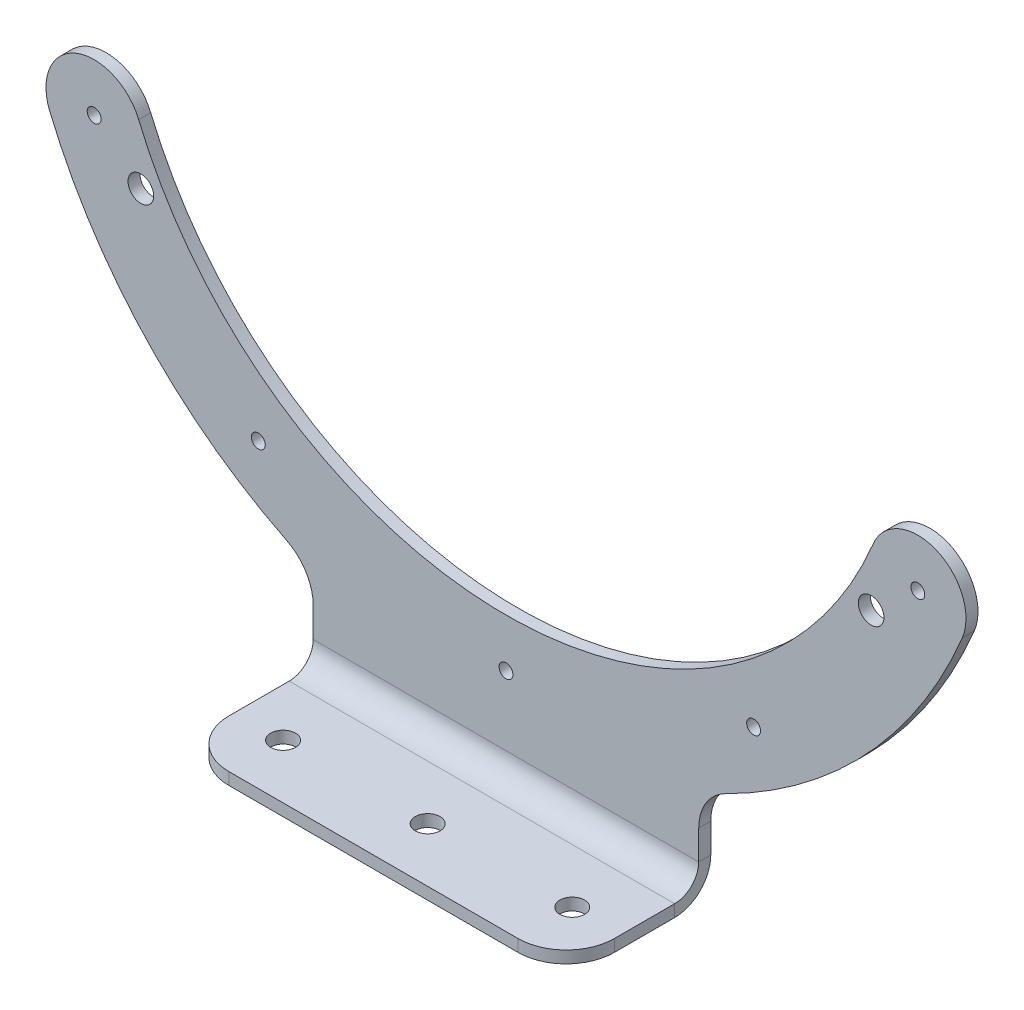
ISO-10303-21;
HEADER;
FILE_DESCRIPTION(('STEP AP214'),'2;1');
FILE_NAME('part.step','',(''),(''),'','','');
FILE_SCHEMA(('AUTOMOTIVE_DESIGN { 1 0 10303 214 1 1 1 1 }'));
ENDSEC;
DATA;
#1=APPLICATION_CONTEXT('core data for automotive mechanical design processes');
#2=APPLICATION_PROTOCOL_DEFINITION('international standard','automotive_design',2000,#1);
#3=PRODUCT_CONTEXT('',#1,'mechanical');
#4=PRODUCT('Part','Part','',(#3));
#5=PRODUCT_RELATED_PRODUCT_CATEGORY('part','',(#4));
#6=PRODUCT_DEFINITION_FORMATION('','',#4);
#7=PRODUCT_DEFINITION_CONTEXT('part definition',#1,'design');
#8=PRODUCT_DEFINITION('design','',#6,#7);
#9=PRODUCT_DEFINITION_SHAPE('','',#8);
#10=(LENGTH_UNIT() NAMED_UNIT(*) SI_UNIT(.MILLI.,.METRE.));
#11=(NAMED_UNIT(*) PLANE_ANGLE_UNIT() SI_UNIT($,.RADIAN.));
#12=(NAMED_UNIT(*) SI_UNIT($,.STERADIAN.) SOLID_ANGLE_UNIT());
#13=UNCERTAINTY_MEASURE_WITH_UNIT(LENGTH_MEASURE(1.E-05),#10,'distance_accuracy_value','');
#14=(GEOMETRIC_REPRESENTATION_CONTEXT(3) GLOBAL_UNCERTAINTY_ASSIGNED_CONTEXT((#13)) GLOBAL_UNIT_ASSIGNED_CONTEXT((#10,
#11,#12)) REPRESENTATION_CONTEXT('',''));
#15=CARTESIAN_POINT('',(0.,0.,0.));
#16=DIRECTION('',(0.,0.,1.));
#17=DIRECTION('',(1.,0.,0.));
#18=AXIS2_PLACEMENT_3D('',#15,#16,#17);
#19=CARTESIAN_POINT('',(50.8,-12.7,-3.175));
#20=DIRECTION('',(1.,0.,0.));
#21=DIRECTION('',(0.,0.,-1.));
#22=AXIS2_PLACEMENT_3D('',#19,#20,#21);
#23=PLANE('',#22);
#24=DIRECTION('',(0.,1.,0.));
#25=VECTOR('',#24,1.);
#26=CARTESIAN_POINT('',(50.8,-12.7,-3.175));
#27=LINE('',#26,#25);
#28=CARTESIAN_POINT('',(50.8,-3.17500000000002,-3.175));
#29=VERTEX_POINT('',#28);
#30=CARTESIAN_POINT('',(50.8,4.56527990568364,-3.175));
#31=VERTEX_POINT('',#30);
#32=EDGE_CURVE('E256',#29,#31,#27,.T.);
#33=ORIENTED_EDGE('',*,*,#32,.T.);
#34=DIRECTION('',(0.,0.,-1.));
#35=VECTOR('',#34,1.);
#36=CARTESIAN_POINT('',(50.8,4.56527990568364,0.));
#37=LINE('',#36,#35);
#38=CARTESIAN_POINT('',(50.8,4.56527990568364,0.));
#39=VERTEX_POINT('',#38);
#40=EDGE_CURVE('E301',#31,#39,#37,.F.);
#41=ORIENTED_EDGE('',*,*,#40,.T.);
#42=DIRECTION('',(0.,1.,0.));
#43=VECTOR('',#42,1.);
#44=CARTESIAN_POINT('',(50.8,-12.7,0.));
#45=LINE('',#44,#43);
#46=CARTESIAN_POINT('',(50.8,-3.17500000000001,0.));
#47=VERTEX_POINT('',#46);
#48=EDGE_CURVE('E242',#47,#39,#45,.T.);
#49=ORIENTED_EDGE('',*,*,#48,.F.);
#50=DIRECTION('',(0.,0.,-1.));
#51=VECTOR('',#50,1.);
#52=CARTESIAN_POINT('',(50.8,-3.17500000000002,0.));
#53=LINE('',#52,#51);
#54=EDGE_CURVE('E225',#47,#29,#53,.T.);
#55=ORIENTED_EDGE('',*,*,#54,.T.);
#56=EDGE_LOOP('',(#33,#41,#49,#55));
#57=FACE_BOUND('',#56,.T.);
#58=ADVANCED_FACE('F56',(#57),#23,.T.);
#59=CARTESIAN_POINT('',(0.,132.553621659923,-3.175));
#60=DIRECTION('',(0.,0.,1.));
#61=DIRECTION('',(1.,0.,0.));
#62=AXIS2_PLACEMENT_3D('',#59,#60,#61);
#63=PLANE('',#62);
#64=CARTESIAN_POINT('',(-96.2370729955459,76.9911216599233,-3.175));
#65=DIRECTION('',(0.,0.,1.));
#66=DIRECTION('',(1.,0.,0.));
#67=AXIS2_PLACEMENT_3D('',#64,#65,#66);
#68=CIRCLE('',#67,3.3782);
#69=CARTESIAN_POINT('',(-92.8588729955459,76.9911216599233,-3.175));
#70=VERTEX_POINT('',#69);
#71=EDGE_CURVE('E775',#70,#70,#68,.T.);
#72=ORIENTED_EDGE('',*,*,#71,.T.);
#73=EDGE_LOOP('',(#72));
#74=FACE_BOUND('',#73,.T.);
#75=CARTESIAN_POINT('',(96.2370729955459,76.9911216599234,-3.175));
#76=DIRECTION('',(0.,0.,1.));
#77=DIRECTION('',(1.,0.,0.));
#78=AXIS2_PLACEMENT_3D('',#75,#76,#77);
#79=CIRCLE('',#78,3.3782);
#80=CARTESIAN_POINT('',(99.6152729955459,76.9911216599234,-3.175));
#81=VERTEX_POINT('',#80);
#82=EDGE_CURVE('E771',#81,#81,#79,.T.);
#83=ORIENTED_EDGE('',*,*,#82,.T.);
#84=EDGE_LOOP('',(#83));
#85=FACE_BOUND('',#84,.T.);
#86=CARTESIAN_POINT('',(108.532748081764,87.5978854428344,-3.175));
#87=DIRECTION('',(0.,0.,1.));
#88=DIRECTION('',(1.,0.,0.));
#89=AXIS2_PLACEMENT_3D('',#86,#87,#88);
#90=CIRCLE('',#89,1.82879999999999);
#91=CARTESIAN_POINT('',(110.361548081763,87.5978854428344,-3.175));
#92=VERTEX_POINT('',#91);
#93=EDGE_CURVE('E767',#92,#92,#90,.T.);
#94=ORIENTED_EDGE('',*,*,#93,.T.);
#95=EDGE_LOOP('',(#94));
#96=FACE_BOUND('',#95,.T.);
#97=CARTESIAN_POINT('',(65.2656131239778,34.8767289546816,-3.175));
#98=DIRECTION('',(0.,0.,1.));
#99=DIRECTION('',(1.,0.,0.));
#100=AXIS2_PLACEMENT_3D('',#97,#98,#99);
#101=CIRCLE('',#100,1.82879999999999);
#102=CARTESIAN_POINT('',(67.0944131239778,34.8767289546816,-3.175));
#103=VERTEX_POINT('',#102);
#104=EDGE_CURVE('E763',#103,#103,#101,.T.);
#105=ORIENTED_EDGE('',*,*,#104,.T.);
#106=EDGE_LOOP('',(#105));
#107=FACE_BOUND('',#106,.T.);
#108=CARTESIAN_POINT('',(0.,15.0786216599231,-3.175));
#109=DIRECTION('',(0.,0.,1.));
#110=DIRECTION('',(1.,0.,0.));
#111=AXIS2_PLACEMENT_3D('',#108,#109,#110);
#112=CIRCLE('',#111,1.82879999999999);
#113=CARTESIAN_POINT('',(1.82879999999992,15.0786216599231,-3.175));
#114=VERTEX_POINT('',#113);
#115=EDGE_CURVE('E758',#114,#114,#112,.T.);
#116=ORIENTED_EDGE('',*,*,#115,.T.);
#117=EDGE_LOOP('',(#116));
#118=FACE_BOUND('',#117,.T.);
#119=CARTESIAN_POINT('',(-65.265613123978,34.8767289546817,-3.175));
#120=DIRECTION('',(0.,0.,1.));
#121=DIRECTION('',(1.,0.,0.));
#122=AXIS2_PLACEMENT_3D('',#119,#120,#121);
#123=CIRCLE('',#122,1.82879999999999);
#124=CARTESIAN_POINT('',(-63.436813123978,34.8767289546817,-3.175));
#125=VERTEX_POINT('',#124);
#126=EDGE_CURVE('E436',#125,#125,#123,.T.);
#127=ORIENTED_EDGE('',*,*,#126,.T.);
#128=EDGE_LOOP('',(#127));
#129=FACE_BOUND('',#128,.T.);
#130=CARTESIAN_POINT('',(-108.532748081764,87.5978854428345,-3.175));
#131=DIRECTION('',(0.,0.,1.));
#132=DIRECTION('',(1.,0.,0.));
#133=AXIS2_PLACEMENT_3D('',#130,#131,#132);
#134=CIRCLE('',#133,1.82879999999999);
#135=CARTESIAN_POINT('',(-106.703948081764,87.5978854428345,-3.175));
#136=VERTEX_POINT('',#135);
#137=EDGE_CURVE('E435',#136,#136,#134,.T.);
#138=ORIENTED_EDGE('',*,*,#137,.T.);
#139=EDGE_LOOP('',(#138));
#140=FACE_BOUND('',#139,.T.);
#141=DIRECTION('',(1.,0.,0.));
#142=VECTOR('',#141,1.);
#143=CARTESIAN_POINT('',(50.8,-3.17500000000002,-3.175));
#144=LINE('',#143,#142);
#145=CARTESIAN_POINT('',(-50.8,-3.17500000000001,-3.175));
#146=VERTEX_POINT('',#145);
#147=EDGE_CURVE('E176',#29,#146,#144,.F.);
#148=ORIENTED_EDGE('',*,*,#147,.T.);
#149=DIRECTION('',(0.,-1.,0.));
#150=VECTOR('',#149,1.);
#151=CARTESIAN_POINT('',(-50.8,-12.7,-3.175));
#152=LINE('',#151,#150);
#153=CARTESIAN_POINT('',(-50.8,4.56527990568364,-3.175));
#154=VERTEX_POINT('',#153);
#155=EDGE_CURVE('E254',#154,#146,#152,.T.);
#156=ORIENTED_EDGE('',*,*,#155,.F.);
#157=CARTESIAN_POINT('',(-63.5,4.56527990568364,-3.175));
#158=DIRECTION('',(0.,0.,1.));
#159=DIRECTION('',(1.,0.,0.));
#160=AXIS2_PLACEMENT_3D('',#157,#158,#159);
#161=CIRCLE('',#160,12.7);
#162=CARTESIAN_POINT('',(-57.8555555555556,15.9420213949494,-3.175));
#163=VERTEX_POINT('',#162);
#164=EDGE_CURVE('E13',#154,#163,#161,.T.);
#165=ORIENTED_EDGE('',*,*,#164,.T.);
#166=CARTESIAN_POINT('',(0.,132.553621659923,-3.175));
#167=DIRECTION('',(0.,0.,1.));
#168=DIRECTION('',(1.,0.,0.));
#169=AXIS2_PLACEMENT_3D('',#166,#167,#168);
#170=CIRCLE('',#169,130.175);
#171=CARTESIAN_POINT('',(-120.266018144657,82.7378058517979,-3.175));
#172=VERTEX_POINT('',#171);
#173=EDGE_CURVE('E251',#172,#163,#170,.T.);
#174=ORIENTED_EDGE('',*,*,#173,.F.);
#175=CARTESIAN_POINT('',(-108.532748081764,87.5978854428345,-3.175));
#176=DIRECTION('',(0.,0.,1.));
#177=DIRECTION('',(-1.,0.,0.));
#178=AXIS2_PLACEMENT_3D('',#175,#176,#177);
#179=CIRCLE('',#178,12.7);
#180=CARTESIAN_POINT('',(-96.7994780188702,92.4579650338711,-3.175));
#181=VERTEX_POINT('',#180);
#182=EDGE_CURVE('E248',#181,#172,#179,.T.);
#183=ORIENTED_EDGE('',*,*,#182,.F.);
#184=CARTESIAN_POINT('',(0.,132.553621659923,-3.175));
#185=DIRECTION('',(0.,0.,-1.));
#186=DIRECTION('',(1.,0.,0.));
#187=AXIS2_PLACEMENT_3D('',#184,#185,#186);
#188=CIRCLE('',#187,104.775);
#189=CARTESIAN_POINT('',(96.7994780188702,92.4579650338711,-3.175));
#190=VERTEX_POINT('',#189);
#191=EDGE_CURVE('E245',#190,#181,#188,.T.);
#192=ORIENTED_EDGE('',*,*,#191,.F.);
#193=CARTESIAN_POINT('',(108.532748081764,87.5978854428345,-3.175));
#194=DIRECTION('',(0.,0.,1.));
#195=DIRECTION('',(-1.,0.,0.));
#196=AXIS2_PLACEMENT_3D('',#193,#194,#195);
#197=CIRCLE('',#196,12.7);
#198=CARTESIAN_POINT('',(120.266018144657,82.7378058517979,-3.175));
#199=VERTEX_POINT('',#198);
#200=EDGE_CURVE('E241',#199,#190,#197,.T.);
#201=ORIENTED_EDGE('',*,*,#200,.F.);
#202=CARTESIAN_POINT('',(0.,132.553621659923,-3.175));
#203=DIRECTION('',(0.,0.,1.));
#204=DIRECTION('',(1.,0.,0.));
#205=AXIS2_PLACEMENT_3D('',#202,#203,#204);
#206=CIRCLE('',#205,130.175);
#207=CARTESIAN_POINT('',(57.8555555555556,15.9420213949494,-3.175));
#208=VERTEX_POINT('',#207);
#209=EDGE_CURVE('E239',#208,#199,#206,.T.);
#210=ORIENTED_EDGE('',*,*,#209,.F.);
#211=CARTESIAN_POINT('',(63.5,4.56527990568364,-3.175));
#212=DIRECTION('',(0.,0.,1.));
#213=DIRECTION('',(1.,0.,0.));
#214=AXIS2_PLACEMENT_3D('',#211,#212,#213);
#215=CIRCLE('',#214,12.7);
#216=EDGE_CURVE('E312',#208,#31,#215,.T.);
#217=ORIENTED_EDGE('',*,*,#216,.T.);
#218=ORIENTED_EDGE('',*,*,#32,.F.);
#219=EDGE_LOOP('',(#148,#156,#165,#174,#183,#192,#201,#210,#217,#218));
#220=FACE_BOUND('',#219,.T.);
#221=ADVANCED_FACE('F316',(#74,#85,#96,#107,#118,#129,#140,#220),#63,.F.);
#222=CARTESIAN_POINT('',(0.,132.553621659923,0.));
#223=DIRECTION('',(0.,0.,1.));
#224=DIRECTION('',(1.,0.,0.));
#225=AXIS2_PLACEMENT_3D('',#222,#223,#224);
#226=PLANE('',#225);
#227=CARTESIAN_POINT('',(-96.2370729955459,76.9911216599233,0.));
#228=DIRECTION('',(0.,0.,1.));
#229=DIRECTION('',(1.,0.,0.));
#230=AXIS2_PLACEMENT_3D('',#227,#228,#229);
#231=CIRCLE('',#230,3.3782);
#232=CARTESIAN_POINT('',(-92.8588729955459,76.9911216599233,0.));
#233=VERTEX_POINT('',#232);
#234=EDGE_CURVE('E410',#233,#233,#231,.T.);
#235=ORIENTED_EDGE('',*,*,#234,.F.);
#236=EDGE_LOOP('',(#235));
#237=FACE_BOUND('',#236,.T.);
#238=CARTESIAN_POINT('',(96.2370729955459,76.9911216599234,0.));
#239=DIRECTION('',(0.,0.,1.));
#240=DIRECTION('',(1.,0.,0.));
#241=AXIS2_PLACEMENT_3D('',#238,#239,#240);
#242=CIRCLE('',#241,3.3782);
#243=CARTESIAN_POINT('',(99.6152729955459,76.9911216599234,0.));
#244=VERTEX_POINT('',#243);
#245=EDGE_CURVE('E414',#244,#244,#242,.T.);
#246=ORIENTED_EDGE('',*,*,#245,.F.);
#247=EDGE_LOOP('',(#246));
#248=FACE_BOUND('',#247,.T.);
#249=CARTESIAN_POINT('',(108.532748081764,87.5978854428344,0.));
#250=DIRECTION('',(0.,0.,1.));
#251=DIRECTION('',(1.,0.,0.));
#252=AXIS2_PLACEMENT_3D('',#249,#250,#251);
#253=CIRCLE('',#252,1.82879999999999);
#254=CARTESIAN_POINT('',(110.361548081763,87.5978854428344,0.));
#255=VERTEX_POINT('',#254);
#256=EDGE_CURVE('E418',#255,#255,#253,.T.);
#257=ORIENTED_EDGE('',*,*,#256,.F.);
#258=EDGE_LOOP('',(#257));
#259=FACE_BOUND('',#258,.T.);
#260=CARTESIAN_POINT('',(65.2656131239778,34.8767289546816,0.));
#261=DIRECTION('',(0.,0.,1.));
#262=DIRECTION('',(1.,0.,0.));
#263=AXIS2_PLACEMENT_3D('',#260,#261,#262);
#264=CIRCLE('',#263,1.82879999999999);
#265=CARTESIAN_POINT('',(67.0944131239778,34.8767289546816,0.));
#266=VERTEX_POINT('',#265);
#267=EDGE_CURVE('E422',#266,#266,#264,.T.);
#268=ORIENTED_EDGE('',*,*,#267,.F.);
#269=EDGE_LOOP('',(#268));
#270=FACE_BOUND('',#269,.T.);
#271=CARTESIAN_POINT('',(0.,15.0786216599231,0.));
#272=DIRECTION('',(0.,0.,1.));
#273=DIRECTION('',(1.,0.,0.));
#274=AXIS2_PLACEMENT_3D('',#271,#272,#273);
#275=CIRCLE('',#274,1.82879999999999);
#276=CARTESIAN_POINT('',(1.82879999999992,15.0786216599231,0.));
#277=VERTEX_POINT('',#276);
#278=EDGE_CURVE('E426',#277,#277,#275,.T.);
#279=ORIENTED_EDGE('',*,*,#278,.F.);
#280=EDGE_LOOP('',(#279));
#281=FACE_BOUND('',#280,.T.);
#282=CARTESIAN_POINT('',(-65.265613123978,34.8767289546817,0.));
#283=DIRECTION('',(0.,0.,1.));
#284=DIRECTION('',(1.,0.,0.));
#285=AXIS2_PLACEMENT_3D('',#282,#283,#284);
#286=CIRCLE('',#285,1.82879999999999);
#287=CARTESIAN_POINT('',(-63.436813123978,34.8767289546817,0.));
#288=VERTEX_POINT('',#287);
#289=EDGE_CURVE('E430',#288,#288,#286,.T.);
#290=ORIENTED_EDGE('',*,*,#289,.F.);
#291=EDGE_LOOP('',(#290));
#292=FACE_BOUND('',#291,.T.);
#293=CARTESIAN_POINT('',(-108.532748081764,87.5978854428345,0.));
#294=DIRECTION('',(0.,0.,1.));
#295=DIRECTION('',(1.,0.,0.));
#296=AXIS2_PLACEMENT_3D('',#293,#294,#295);
#297=CIRCLE('',#296,1.82879999999999);
#298=CARTESIAN_POINT('',(-106.703948081764,87.5978854428345,0.));
#299=VERTEX_POINT('',#298);
#300=EDGE_CURVE('E433',#299,#299,#297,.T.);
#301=ORIENTED_EDGE('',*,*,#300,.F.);
#302=EDGE_LOOP('',(#301));
#303=FACE_BOUND('',#302,.T.);
#304=CARTESIAN_POINT('',(0.,132.553621659923,0.));
#305=DIRECTION('',(0.,0.,1.));
#306=DIRECTION('',(1.,0.,0.));
#307=AXIS2_PLACEMENT_3D('',#304,#305,#306);
#308=CIRCLE('',#307,130.175);
#309=CARTESIAN_POINT('',(-120.266018144657,82.7378058517979,0.));
#310=VERTEX_POINT('',#309);
#311=CARTESIAN_POINT('',(-57.8555555555556,15.9420213949494,0.));
#312=VERTEX_POINT('',#311);
#313=EDGE_CURVE('E270',#310,#312,#308,.T.);
#314=ORIENTED_EDGE('',*,*,#313,.T.);
#315=CARTESIAN_POINT('',(-63.5,4.56527990568364,0.));
#316=DIRECTION('',(0.,0.,1.));
#317=DIRECTION('',(1.,0.,0.));
#318=AXIS2_PLACEMENT_3D('',#315,#316,#317);
#319=CIRCLE('',#318,12.7);
#320=CARTESIAN_POINT('',(-50.8,4.56527990568364,0.));
#321=VERTEX_POINT('',#320);
#322=EDGE_CURVE('E64',#312,#321,#319,.F.);
#323=ORIENTED_EDGE('',*,*,#322,.T.);
#324=DIRECTION('',(0.,-1.,0.));
#325=VECTOR('',#324,1.);
#326=CARTESIAN_POINT('',(-50.8,-12.7,0.));
#327=LINE('',#326,#325);
#328=CARTESIAN_POINT('',(-50.8,-3.17500000000003,0.));
#329=VERTEX_POINT('',#328);
#330=EDGE_CURVE('E272',#321,#329,#327,.T.);
#331=ORIENTED_EDGE('',*,*,#330,.T.);
#332=DIRECTION('',(1.,0.,0.));
#333=VECTOR('',#332,1.);
#334=CARTESIAN_POINT('',(50.8,-3.17500000000002,0.));
#335=LINE('',#334,#333);
#336=EDGE_CURVE('E229',#47,#329,#335,.F.);
#337=ORIENTED_EDGE('',*,*,#336,.F.);
#338=ORIENTED_EDGE('',*,*,#48,.T.);
#339=CARTESIAN_POINT('',(63.5,4.56527990568364,0.));
#340=DIRECTION('',(0.,0.,1.));
#341=DIRECTION('',(1.,0.,0.));
#342=AXIS2_PLACEMENT_3D('',#339,#340,#341);
#343=CIRCLE('',#342,12.7);
#344=CARTESIAN_POINT('',(57.8555555555556,15.9420213949494,0.));
#345=VERTEX_POINT('',#344);
#346=EDGE_CURVE('E310',#39,#345,#343,.F.);
#347=ORIENTED_EDGE('',*,*,#346,.T.);
#348=CARTESIAN_POINT('',(0.,132.553621659923,0.));
#349=DIRECTION('',(0.,0.,1.));
#350=DIRECTION('',(1.,0.,0.));
#351=AXIS2_PLACEMENT_3D('',#348,#349,#350);
#352=CIRCLE('',#351,130.175);
#353=CARTESIAN_POINT('',(120.266018144657,82.7378058517979,0.));
#354=VERTEX_POINT('',#353);
#355=EDGE_CURVE('E236',#345,#354,#352,.T.);
#356=ORIENTED_EDGE('',*,*,#355,.T.);
#357=CARTESIAN_POINT('',(108.532748081764,87.5978854428345,0.));
#358=DIRECTION('',(0.,0.,1.));
#359=DIRECTION('',(-1.,0.,0.));
#360=AXIS2_PLACEMENT_3D('',#357,#358,#359);
#361=CIRCLE('',#360,12.7);
#362=CARTESIAN_POINT('',(96.7994780188702,92.4579650338711,0.));
#363=VERTEX_POINT('',#362);
#364=EDGE_CURVE('E261',#354,#363,#361,.T.);
#365=ORIENTED_EDGE('',*,*,#364,.T.);
#366=CARTESIAN_POINT('',(0.,132.553621659923,0.));
#367=DIRECTION('',(0.,0.,-1.));
#368=DIRECTION('',(1.,0.,0.));
#369=AXIS2_PLACEMENT_3D('',#366,#367,#368);
#370=CIRCLE('',#369,104.775);
#371=CARTESIAN_POINT('',(-96.7994780188702,92.4579650338711,0.));
#372=VERTEX_POINT('',#371);
#373=EDGE_CURVE('E264',#363,#372,#370,.T.);
#374=ORIENTED_EDGE('',*,*,#373,.T.);
#375=CARTESIAN_POINT('',(-108.532748081764,87.5978854428345,0.));
#376=DIRECTION('',(0.,0.,1.));
#377=DIRECTION('',(-1.,0.,0.));
#378=AXIS2_PLACEMENT_3D('',#375,#376,#377);
#379=CIRCLE('',#378,12.7);
#380=EDGE_CURVE('E267',#372,#310,#379,.T.);
#381=ORIENTED_EDGE('',*,*,#380,.T.);
#382=EDGE_LOOP('',(#314,#323,#331,#337,#338,#347,#356,#365,#374,#381));
#383=FACE_BOUND('',#382,.T.);
#384=ADVANCED_FACE('F325',(#237,#248,#259,#270,#281,#292,#303,#383),#226,.T.);
#385=CARTESIAN_POINT('',(0.,132.553621659923,-3.175));
#386=DIRECTION('',(0.,0.,1.));
#387=DIRECTION('',(1.,0.,0.));
#388=AXIS2_PLACEMENT_3D('',#385,#386,#387);
#389=CYLINDRICAL_SURFACE('',#388,130.175);
#390=ORIENTED_EDGE('',*,*,#355,.F.);
#391=DIRECTION('',(0.,0.,1.));
#392=VECTOR('',#391,1.);
#393=CARTESIAN_POINT('',(57.8555555555556,15.9420213949494,-3.175));
#394=LINE('',#393,#392);
#395=EDGE_CURVE('E304',#345,#208,#394,.F.);
#396=ORIENTED_EDGE('',*,*,#395,.T.);
#397=ORIENTED_EDGE('',*,*,#209,.T.);
#398=DIRECTION('',(0.,0.,1.));
#399=VECTOR('',#398,1.);
#400=CARTESIAN_POINT('',(120.266018144657,82.7378058517979,-3.175));
#401=LINE('',#400,#399);
#402=EDGE_CURVE('E259',#199,#354,#401,.T.);
#403=ORIENTED_EDGE('',*,*,#402,.T.);
#404=EDGE_LOOP('',(#390,#396,#397,#403));
#405=FACE_BOUND('',#404,.T.);
#406=ADVANCED_FACE('F327',(#405),#389,.T.);
#407=CARTESIAN_POINT('',(-50.8,-12.7,-3.175));
#408=DIRECTION('',(-1.,0.,0.));
#409=DIRECTION('',(0.,0.,1.));
#410=AXIS2_PLACEMENT_3D('',#407,#408,#409);
#411=PLANE('',#410);
#412=ORIENTED_EDGE('',*,*,#330,.F.);
#413=DIRECTION('',(0.,0.,-1.));
#414=VECTOR('',#413,1.);
#415=CARTESIAN_POINT('',(-50.8,4.56527990568364,-3.175));
#416=LINE('',#415,#414);
#417=EDGE_CURVE('E71',#321,#154,#416,.T.);
#418=ORIENTED_EDGE('',*,*,#417,.T.);
#419=ORIENTED_EDGE('',*,*,#155,.T.);
#420=DIRECTION('',(0.,0.,-1.));
#421=VECTOR('',#420,1.);
#422=CARTESIAN_POINT('',(-50.8,-3.17500000000003,0.));
#423=LINE('',#422,#421);
#424=EDGE_CURVE('E233',#329,#146,#423,.T.);
#425=ORIENTED_EDGE('',*,*,#424,.F.);
#426=EDGE_LOOP('',(#412,#418,#419,#425));
#427=FACE_BOUND('',#426,.T.);
#428=ADVANCED_FACE('F348',(#427),#411,.T.);
#429=CARTESIAN_POINT('',(0.,132.553621659923,-3.175));
#430=DIRECTION('',(0.,0.,1.));
#431=DIRECTION('',(1.,0.,0.));
#432=AXIS2_PLACEMENT_3D('',#429,#430,#431);
#433=CYLINDRICAL_SURFACE('',#432,130.175);
#434=ORIENTED_EDGE('',*,*,#173,.T.);
#435=DIRECTION('',(0.,0.,1.));
#436=VECTOR('',#435,1.);
#437=CARTESIAN_POINT('',(-57.8555555555556,15.9420213949494,-3.175));
#438=LINE('',#437,#436);
#439=EDGE_CURVE('E306',#163,#312,#438,.T.);
#440=ORIENTED_EDGE('',*,*,#439,.T.);
#441=ORIENTED_EDGE('',*,*,#313,.F.);
#442=DIRECTION('',(0.,0.,1.));
#443=VECTOR('',#442,1.);
#444=CARTESIAN_POINT('',(-120.266018144657,82.7378058517979,-3.175));
#445=LINE('',#444,#443);
#446=EDGE_CURVE('E276',#172,#310,#445,.T.);
#447=ORIENTED_EDGE('',*,*,#446,.F.);
#448=EDGE_LOOP('',(#434,#440,#441,#447));
#449=FACE_BOUND('',#448,.T.);
#450=ADVANCED_FACE('F343',(#449),#433,.T.);
#451=CARTESIAN_POINT('',(-108.532748081764,87.5978854428345,-3.175));
#452=DIRECTION('',(0.,0.,1.));
#453=DIRECTION('',(1.,0.,0.));
#454=AXIS2_PLACEMENT_3D('',#451,#452,#453);
#455=CYLINDRICAL_SURFACE('',#454,12.7);
#456=ORIENTED_EDGE('',*,*,#380,.F.);
#457=DIRECTION('',(0.,0.,1.));
#458=VECTOR('',#457,1.);
#459=CARTESIAN_POINT('',(-96.7994780188702,92.4579650338711,-3.175));
#460=LINE('',#459,#458);
#461=EDGE_CURVE('E279',#181,#372,#460,.T.);
#462=ORIENTED_EDGE('',*,*,#461,.F.);
#463=ORIENTED_EDGE('',*,*,#182,.T.);
#464=ORIENTED_EDGE('',*,*,#446,.T.);
#465=EDGE_LOOP('',(#456,#462,#463,#464));
#466=FACE_BOUND('',#465,.T.);
#467=ADVANCED_FACE('F339',(#466),#455,.T.);
#468=CARTESIAN_POINT('',(0.,132.553621659923,-3.175));
#469=DIRECTION('',(0.,0.,1.));
#470=DIRECTION('',(1.,0.,0.));
#471=AXIS2_PLACEMENT_3D('',#468,#469,#470);
#472=CYLINDRICAL_SURFACE('',#471,104.775);
#473=ORIENTED_EDGE('',*,*,#373,.F.);
#474=DIRECTION('',(0.,0.,1.));
#475=VECTOR('',#474,1.);
#476=CARTESIAN_POINT('',(96.7994780188702,92.4579650338711,-3.175));
#477=LINE('',#476,#475);
#478=EDGE_CURVE('E281',#190,#363,#477,.T.);
#479=ORIENTED_EDGE('',*,*,#478,.F.);
#480=ORIENTED_EDGE('',*,*,#191,.T.);
#481=ORIENTED_EDGE('',*,*,#461,.T.);
#482=EDGE_LOOP('',(#473,#479,#480,#481));
#483=FACE_BOUND('',#482,.T.);
#484=ADVANCED_FACE('F335',(#483),#472,.F.);
#485=CARTESIAN_POINT('',(108.532748081764,87.5978854428345,-3.175));
#486=DIRECTION('',(0.,0.,1.));
#487=DIRECTION('',(1.,0.,0.));
#488=AXIS2_PLACEMENT_3D('',#485,#486,#487);
#489=CYLINDRICAL_SURFACE('',#488,12.7);
#490=ORIENTED_EDGE('',*,*,#364,.F.);
#491=ORIENTED_EDGE('',*,*,#402,.F.);
#492=ORIENTED_EDGE('',*,*,#200,.T.);
#493=ORIENTED_EDGE('',*,*,#478,.T.);
#494=EDGE_LOOP('',(#490,#491,#492,#493));
#495=FACE_BOUND('',#494,.T.);
#496=ADVANCED_FACE('F331',(#495),#489,.T.);
#497=CARTESIAN_POINT('',(-50.8,-3.17500000000003,6.35));
#498=DIRECTION('',(-1.,0.,0.));
#499=DIRECTION('',(0.,0.,1.));
#500=AXIS2_PLACEMENT_3D('',#497,#498,#499);
#501=PLANE('',#500);
#502=DIRECTION('',(0.,1.,0.));
#503=VECTOR('',#502,1.);
#504=CARTESIAN_POINT('',(-50.8,-12.7,6.34999999999997));
#505=LINE('',#504,#503);
#506=CARTESIAN_POINT('',(-50.8,-9.52500000000002,6.34999999999998));
#507=VERTEX_POINT('',#506);
#508=CARTESIAN_POINT('',(-50.8,-12.7,6.34999999999997));
#509=VERTEX_POINT('',#508);
#510=EDGE_CURVE('E219',#507,#509,#505,.F.);
#511=ORIENTED_EDGE('',*,*,#510,.F.);
#512=CARTESIAN_POINT('',(-50.8,-3.17500000000003,6.35));
#513=DIRECTION('',(1.,0.,0.));
#514=DIRECTION('',(0.,0.,-1.));
#515=AXIS2_PLACEMENT_3D('',#512,#513,#514);
#516=CIRCLE('',#515,6.35);
#517=EDGE_CURVE('E179',#329,#507,#516,.F.);
#518=ORIENTED_EDGE('',*,*,#517,.F.);
#519=ORIENTED_EDGE('',*,*,#424,.T.);
#520=CARTESIAN_POINT('',(-50.8,-3.17500000000003,6.35));
#521=DIRECTION('',(1.,0.,0.));
#522=DIRECTION('',(0.,0.,-1.));
#523=AXIS2_PLACEMENT_3D('',#520,#521,#522);
#524=CIRCLE('',#523,9.525);
#525=EDGE_CURVE('E224',#146,#509,#524,.F.);
#526=ORIENTED_EDGE('',*,*,#525,.T.);
#527=EDGE_LOOP('',(#511,#518,#519,#526));
#528=FACE_BOUND('',#527,.T.);
#529=ADVANCED_FACE('F355',(#528),#501,.T.);
#530=CARTESIAN_POINT('',(50.8,-3.17500000000002,6.34999999999999));
#531=DIRECTION('',(-1.,0.,0.));
#532=DIRECTION('',(0.,0.,1.));
#533=AXIS2_PLACEMENT_3D('',#530,#531,#532);
#534=PLANE('',#533);
#535=CARTESIAN_POINT('',(50.8,-3.17500000000002,6.34999999999999));
#536=DIRECTION('',(1.,0.,0.));
#537=DIRECTION('',(0.,0.,-1.));
#538=AXIS2_PLACEMENT_3D('',#535,#536,#537);
#539=CIRCLE('',#538,6.35);
#540=CARTESIAN_POINT('',(50.8,-9.52500000000001,6.34999999999997));
#541=VERTEX_POINT('',#540);
#542=EDGE_CURVE('E186',#541,#47,#539,.T.);
#543=ORIENTED_EDGE('',*,*,#542,.F.);
#544=DIRECTION('',(0.,1.,0.));
#545=VECTOR('',#544,1.);
#546=CARTESIAN_POINT('',(50.8,-9.52500000000002,6.34999999999997));
#547=LINE('',#546,#545);
#548=CARTESIAN_POINT('',(50.8,-12.7,6.34999999999996));
#549=VERTEX_POINT('',#548);
#550=EDGE_CURVE('E183',#541,#549,#547,.F.);
#551=ORIENTED_EDGE('',*,*,#550,.T.);
#552=CARTESIAN_POINT('',(50.8,-3.17500000000002,6.34999999999999));
#553=DIRECTION('',(1.,0.,0.));
#554=DIRECTION('',(0.,0.,-1.));
#555=AXIS2_PLACEMENT_3D('',#552,#553,#554);
#556=CIRCLE('',#555,9.525);
#557=EDGE_CURVE('E168',#549,#29,#556,.T.);
#558=ORIENTED_EDGE('',*,*,#557,.T.);
#559=ORIENTED_EDGE('',*,*,#54,.F.);
#560=EDGE_LOOP('',(#543,#551,#558,#559));
#561=FACE_BOUND('',#560,.T.);
#562=ADVANCED_FACE('F184',(#561),#534,.F.);
#563=CARTESIAN_POINT('',(50.8,-3.17500000000002,6.34999999999999));
#564=DIRECTION('',(1.,0.,0.));
#565=DIRECTION('',(0.,-1.,0.));
#566=AXIS2_PLACEMENT_3D('',#563,#564,#565);
#567=CYLINDRICAL_SURFACE('',#566,9.525);
#568=ORIENTED_EDGE('',*,*,#147,.F.);
#569=ORIENTED_EDGE('',*,*,#557,.F.);
#570=DIRECTION('',(1.,0.,0.));
#571=VECTOR('',#570,1.);
#572=CARTESIAN_POINT('',(-50.8,-12.7,6.34999999999997));
#573=LINE('',#572,#571);
#574=EDGE_CURVE('E173',#549,#509,#573,.F.);
#575=ORIENTED_EDGE('',*,*,#574,.T.);
#576=ORIENTED_EDGE('',*,*,#525,.F.);
#577=EDGE_LOOP('',(#568,#569,#575,#576));
#578=FACE_BOUND('',#577,.T.);
#579=ADVANCED_FACE('F170',(#578),#567,.T.);
#580=CARTESIAN_POINT('',(50.8,-3.17500000000002,6.34999999999999));
#581=DIRECTION('',(1.,0.,0.));
#582=DIRECTION('',(0.,-1.,0.));
#583=AXIS2_PLACEMENT_3D('',#580,#581,#582);
#584=CYLINDRICAL_SURFACE('',#583,6.35);
#585=ORIENTED_EDGE('',*,*,#336,.T.);
#586=ORIENTED_EDGE('',*,*,#517,.T.);
#587=DIRECTION('',(1.,0.,0.));
#588=VECTOR('',#587,1.);
#589=CARTESIAN_POINT('',(-50.8,-9.52500000000002,6.34999999999998));
#590=LINE('',#589,#588);
#591=EDGE_CURVE('E191',#507,#541,#590,.T.);
#592=ORIENTED_EDGE('',*,*,#591,.T.);
#593=ORIENTED_EDGE('',*,*,#542,.T.);
#594=EDGE_LOOP('',(#585,#586,#592,#593));
#595=FACE_BOUND('',#594,.T.);
#596=ADVANCED_FACE('F352',(#595),#584,.F.);
#597=CARTESIAN_POINT('',(-50.8,-12.7,0.));
#598=DIRECTION('',(1.,0.,0.));
#599=DIRECTION('',(0.,0.,-1.));
#600=AXIS2_PLACEMENT_3D('',#597,#598,#599);
#601=PLANE('',#600);
#602=DIRECTION('',(0.,0.,-1.));
#603=VECTOR('',#602,1.);
#604=CARTESIAN_POINT('',(-50.8,-12.7,0.));
#605=LINE('',#604,#603);
#606=CARTESIAN_POINT('',(-50.8,-12.7000000000001,22.225));
#607=VERTEX_POINT('',#606);
#608=EDGE_CURVE('E199',#607,#509,#605,.T.);
#609=ORIENTED_EDGE('',*,*,#608,.F.);
#610=DIRECTION('',(0.,1.,0.));
#611=VECTOR('',#610,1.);
#612=CARTESIAN_POINT('',(-50.8,-12.7000000000001,22.225));
#613=LINE('',#612,#611);
#614=CARTESIAN_POINT('',(-50.8,-9.52500000000008,22.225));
#615=VERTEX_POINT('',#614);
#616=EDGE_CURVE('E298',#607,#615,#613,.T.);
#617=ORIENTED_EDGE('',*,*,#616,.T.);
#618=DIRECTION('',(0.,0.,1.));
#619=VECTOR('',#618,1.);
#620=CARTESIAN_POINT('',(-50.8,-9.525,0.));
#621=LINE('',#620,#619);
#622=EDGE_CURVE('E200',#615,#507,#621,.F.);
#623=ORIENTED_EDGE('',*,*,#622,.T.);
#624=ORIENTED_EDGE('',*,*,#510,.T.);
#625=EDGE_LOOP('',(#609,#617,#623,#624));
#626=FACE_BOUND('',#625,.T.);
#627=ADVANCED_FACE('F357',(#626),#601,.F.);
#628=CARTESIAN_POINT('',(50.8,-12.7000000000001,34.925));
#629=DIRECTION('',(-1.,0.,0.));
#630=DIRECTION('',(0.,0.,1.));
#631=AXIS2_PLACEMENT_3D('',#628,#629,#630);
#632=PLANE('',#631);
#633=DIRECTION('',(0.,0.,-1.));
#634=VECTOR('',#633,1.);
#635=CARTESIAN_POINT('',(50.8,-9.52500000000012,34.925));
#636=LINE('',#635,#634);
#637=CARTESIAN_POINT('',(50.8,-9.52500000000008,22.225));
#638=VERTEX_POINT('',#637);
#639=EDGE_CURVE('E215',#541,#638,#636,.F.);
#640=ORIENTED_EDGE('',*,*,#639,.T.);
#641=DIRECTION('',(0.,1.,0.));
#642=VECTOR('',#641,1.);
#643=CARTESIAN_POINT('',(50.8,-12.7000000000001,22.225));
#644=LINE('',#643,#642);
#645=CARTESIAN_POINT('',(50.8,-12.7000000000001,22.225));
#646=VERTEX_POINT('',#645);
#647=EDGE_CURVE('E204',#638,#646,#644,.F.);
#648=ORIENTED_EDGE('',*,*,#647,.T.);
#649=DIRECTION('',(0.,0.,1.));
#650=VECTOR('',#649,1.);
#651=CARTESIAN_POINT('',(50.8,-12.7,0.));
#652=LINE('',#651,#650);
#653=EDGE_CURVE('E196',#549,#646,#652,.T.);
#654=ORIENTED_EDGE('',*,*,#653,.F.);
#655=ORIENTED_EDGE('',*,*,#550,.F.);
#656=EDGE_LOOP('',(#640,#648,#654,#655));
#657=FACE_BOUND('',#656,.T.);
#658=ADVANCED_FACE('F202',(#657),#632,.F.);
#659=CARTESIAN_POINT('',(0.,-12.7,0.));
#660=DIRECTION('',(0.,1.,0.));
#661=DIRECTION('',(0.,0.,1.));
#662=AXIS2_PLACEMENT_3D('',#659,#660,#661);
#663=PLANE('',#662);
#664=CARTESIAN_POINT('',(38.1,-12.7000000000001,20.6375));
#665=DIRECTION('',(0.,1.,0.));
#666=DIRECTION('',(0.,0.,1.));
#667=AXIS2_PLACEMENT_3D('',#664,#665,#666);
#668=CIRCLE('',#667,3.26389999999999);
#669=CARTESIAN_POINT('',(38.1,-12.7000000000001,23.9014));
#670=VERTEX_POINT('',#669);
#671=EDGE_CURVE('E447',#670,#670,#668,.T.);
#672=ORIENTED_EDGE('',*,*,#671,.T.);
#673=EDGE_LOOP('',(#672));
#674=FACE_BOUND('',#673,.T.);
#675=CARTESIAN_POINT('',(0.,-12.7000000000001,20.6375));
#676=DIRECTION('',(0.,1.,0.));
#677=DIRECTION('',(0.,0.,1.));
#678=AXIS2_PLACEMENT_3D('',#675,#676,#677);
#679=CIRCLE('',#678,3.26389999999999);
#680=CARTESIAN_POINT('',(0.,-12.7000000000001,23.9014));
#681=VERTEX_POINT('',#680);
#682=EDGE_CURVE('E453',#681,#681,#679,.T.);
#683=ORIENTED_EDGE('',*,*,#682,.T.);
#684=EDGE_LOOP('',(#683));
#685=FACE_BOUND('',#684,.T.);
#686=CARTESIAN_POINT('',(-38.1,-12.7000000000001,20.6375));
#687=DIRECTION('',(0.,1.,0.));
#688=DIRECTION('',(0.,0.,1.));
#689=AXIS2_PLACEMENT_3D('',#686,#687,#688);
#690=CIRCLE('',#689,3.26389999999999);
#691=CARTESIAN_POINT('',(-38.1,-12.7000000000001,23.9014));
#692=VERTEX_POINT('',#691);
#693=EDGE_CURVE('E222',#692,#692,#690,.T.);
#694=ORIENTED_EDGE('',*,*,#693,.T.);
#695=EDGE_LOOP('',(#694));
#696=FACE_BOUND('',#695,.T.);
#697=ORIENTED_EDGE('',*,*,#653,.T.);
#698=CARTESIAN_POINT('',(38.1,-12.7000000000001,22.225));
#699=DIRECTION('',(0.,1.,0.));
#700=DIRECTION('',(0.,0.,1.));
#701=AXIS2_PLACEMENT_3D('',#698,#699,#700);
#702=CIRCLE('',#701,12.7);
#703=CARTESIAN_POINT('',(38.1,-12.7000000000001,34.925));
#704=VERTEX_POINT('',#703);
#705=EDGE_CURVE('E296',#646,#704,#702,.F.);
#706=ORIENTED_EDGE('',*,*,#705,.T.);
#707=DIRECTION('',(-1.,0.,0.));
#708=VECTOR('',#707,1.);
#709=CARTESIAN_POINT('',(0.,-12.7000000000001,34.925));
#710=LINE('',#709,#708);
#711=CARTESIAN_POINT('',(-38.1,-12.7000000000001,34.925));
#712=VERTEX_POINT('',#711);
#713=EDGE_CURVE('E205',#704,#712,#710,.T.);
#714=ORIENTED_EDGE('',*,*,#713,.T.);
#715=CARTESIAN_POINT('',(-38.1,-12.7000000000001,22.225));
#716=DIRECTION('',(0.,1.,0.));
#717=DIRECTION('',(0.,0.,1.));
#718=AXIS2_PLACEMENT_3D('',#715,#716,#717);
#719=CIRCLE('',#718,12.7);
#720=EDGE_CURVE('E294',#712,#607,#719,.F.);
#721=ORIENTED_EDGE('',*,*,#720,.T.);
#722=ORIENTED_EDGE('',*,*,#608,.T.);
#723=ORIENTED_EDGE('',*,*,#574,.F.);
#724=EDGE_LOOP('',(#697,#706,#714,#721,#722,#723));
#725=FACE_BOUND('',#724,.T.);
#726=ADVANCED_FACE('F195',(#674,#685,#696,#725),#663,.F.);
#727=CARTESIAN_POINT('',(0.,-9.525,0.));
#728=DIRECTION('',(0.,1.,0.));
#729=DIRECTION('',(0.,0.,1.));
#730=AXIS2_PLACEMENT_3D('',#727,#728,#729);
#731=PLANE('',#730);
#732=CARTESIAN_POINT('',(38.1,-9.52500000000007,20.6375));
#733=DIRECTION('',(0.,1.,0.));
#734=DIRECTION('',(0.,0.,1.));
#735=AXIS2_PLACEMENT_3D('',#732,#733,#734);
#736=CIRCLE('',#735,3.26389999999999);
#737=CARTESIAN_POINT('',(38.1,-9.52500000000008,23.9014));
#738=VERTEX_POINT('',#737);
#739=EDGE_CURVE('E439',#738,#738,#736,.T.);
#740=ORIENTED_EDGE('',*,*,#739,.F.);
#741=EDGE_LOOP('',(#740));
#742=FACE_BOUND('',#741,.T.);
#743=CARTESIAN_POINT('',(0.,-9.52500000000007,20.6375));
#744=DIRECTION('',(0.,1.,0.));
#745=DIRECTION('',(0.,0.,1.));
#746=AXIS2_PLACEMENT_3D('',#743,#744,#745);
#747=CIRCLE('',#746,3.2639);
#748=CARTESIAN_POINT('',(0.,-9.52500000000008,23.9014));
#749=VERTEX_POINT('',#748);
#750=EDGE_CURVE('E450',#749,#749,#747,.T.);
#751=ORIENTED_EDGE('',*,*,#750,.F.);
#752=EDGE_LOOP('',(#751));
#753=FACE_BOUND('',#752,.T.);
#754=CARTESIAN_POINT('',(-38.1,-9.52500000000007,20.6375));
#755=DIRECTION('',(0.,1.,0.));
#756=DIRECTION('',(0.,0.,1.));
#757=AXIS2_PLACEMENT_3D('',#754,#755,#756);
#758=CIRCLE('',#757,3.26389999999999);
#759=CARTESIAN_POINT('',(-38.1,-9.52500000000008,23.9014));
#760=VERTEX_POINT('',#759);
#761=EDGE_CURVE('E456',#760,#760,#758,.T.);
#762=ORIENTED_EDGE('',*,*,#761,.F.);
#763=EDGE_LOOP('',(#762));
#764=FACE_BOUND('',#763,.T.);
#765=DIRECTION('',(1.,0.,0.));
#766=VECTOR('',#765,1.);
#767=CARTESIAN_POINT('',(-50.8,-9.52500000000012,34.925));
#768=LINE('',#767,#766);
#769=CARTESIAN_POINT('',(38.1,-9.52500000000012,34.925));
#770=VERTEX_POINT('',#769);
#771=CARTESIAN_POINT('',(-38.1,-9.52500000000012,34.925));
#772=VERTEX_POINT('',#771);
#773=EDGE_CURVE('E209',#770,#772,#768,.F.);
#774=ORIENTED_EDGE('',*,*,#773,.F.);
#775=CARTESIAN_POINT('',(38.1,-9.52500000000007,22.225));
#776=DIRECTION('',(0.,1.,0.));
#777=DIRECTION('',(0.,0.,1.));
#778=AXIS2_PLACEMENT_3D('',#775,#776,#777);
#779=CIRCLE('',#778,12.7);
#780=EDGE_CURVE('E291',#770,#638,#779,.T.);
#781=ORIENTED_EDGE('',*,*,#780,.T.);
#782=ORIENTED_EDGE('',*,*,#639,.F.);
#783=ORIENTED_EDGE('',*,*,#591,.F.);
#784=ORIENTED_EDGE('',*,*,#622,.F.);
#785=CARTESIAN_POINT('',(-38.1,-9.52500000000007,22.225));
#786=DIRECTION('',(0.,1.,0.));
#787=DIRECTION('',(0.,0.,1.));
#788=AXIS2_PLACEMENT_3D('',#785,#786,#787);
#789=CIRCLE('',#788,12.7);
#790=EDGE_CURVE('E289',#615,#772,#789,.T.);
#791=ORIENTED_EDGE('',*,*,#790,.T.);
#792=EDGE_LOOP('',(#774,#781,#782,#783,#784,#791));
#793=FACE_BOUND('',#792,.T.);
#794=ADVANCED_FACE('F362',(#742,#753,#764,#793),#731,.T.);
#795=CARTESIAN_POINT('',(-50.8,-12.7000000000001,34.925));
#796=DIRECTION('',(0.,0.,-1.));
#797=DIRECTION('',(0.,1.,0.));
#798=AXIS2_PLACEMENT_3D('',#795,#796,#797);
#799=PLANE('',#798);
#800=ORIENTED_EDGE('',*,*,#713,.F.);
#801=DIRECTION('',(0.,1.,0.));
#802=VECTOR('',#801,1.);
#803=CARTESIAN_POINT('',(38.1,-12.7000000000001,34.925));
#804=LINE('',#803,#802);
#805=EDGE_CURVE('E286',#704,#770,#804,.T.);
#806=ORIENTED_EDGE('',*,*,#805,.T.);
#807=ORIENTED_EDGE('',*,*,#773,.T.);
#808=DIRECTION('',(0.,1.,0.));
#809=VECTOR('',#808,1.);
#810=CARTESIAN_POINT('',(-38.1,-12.7000000000001,34.925));
#811=LINE('',#810,#809);
#812=EDGE_CURVE('E278',#772,#712,#811,.F.);
#813=ORIENTED_EDGE('',*,*,#812,.T.);
#814=EDGE_LOOP('',(#800,#806,#807,#813));
#815=FACE_BOUND('',#814,.T.);
#816=ADVANCED_FACE('F369',(#815),#799,.F.);
#817=CARTESIAN_POINT('',(-38.1,-9.52500000000007,20.6375));
#818=DIRECTION('',(0.,1.,0.));
#819=DIRECTION('',(0.,0.,1.));
#820=AXIS2_PLACEMENT_3D('',#817,#818,#819);
#821=CYLINDRICAL_SURFACE('',#820,3.26389999999999);
#822=ORIENTED_EDGE('',*,*,#761,.T.);
#823=EDGE_LOOP('',(#822));
#824=FACE_BOUND('',#823,.T.);
#825=ORIENTED_EDGE('',*,*,#693,.F.);
#826=EDGE_LOOP('',(#825));
#827=FACE_BOUND('',#826,.T.);
#828=ADVANCED_FACE('F462',(#824,#827),#821,.F.);
#829=CARTESIAN_POINT('',(0.,-9.52500000000007,20.6375));
#830=DIRECTION('',(0.,1.,0.));
#831=DIRECTION('',(0.,0.,1.));
#832=AXIS2_PLACEMENT_3D('',#829,#830,#831);
#833=CYLINDRICAL_SURFACE('',#832,3.26389999999999);
#834=ORIENTED_EDGE('',*,*,#750,.T.);
#835=EDGE_LOOP('',(#834));
#836=FACE_BOUND('',#835,.T.);
#837=ORIENTED_EDGE('',*,*,#682,.F.);
#838=EDGE_LOOP('',(#837));
#839=FACE_BOUND('',#838,.T.);
#840=ADVANCED_FACE('F464',(#836,#839),#833,.F.);
#841=CARTESIAN_POINT('',(38.1,-9.52500000000007,20.6375));
#842=DIRECTION('',(0.,1.,0.));
#843=DIRECTION('',(0.,0.,1.));
#844=AXIS2_PLACEMENT_3D('',#841,#842,#843);
#845=CYLINDRICAL_SURFACE('',#844,3.26389999999999);
#846=ORIENTED_EDGE('',*,*,#739,.T.);
#847=EDGE_LOOP('',(#846));
#848=FACE_BOUND('',#847,.T.);
#849=ORIENTED_EDGE('',*,*,#671,.F.);
#850=EDGE_LOOP('',(#849));
#851=FACE_BOUND('',#850,.T.);
#852=ADVANCED_FACE('F471',(#848,#851),#845,.F.);
#853=CARTESIAN_POINT('',(-108.532748081764,87.5978854428345,0.));
#854=DIRECTION('',(0.,0.,1.));
#855=DIRECTION('',(1.,0.,0.));
#856=AXIS2_PLACEMENT_3D('',#853,#854,#855);
#857=CYLINDRICAL_SURFACE('',#856,1.82879999999999);
#858=ORIENTED_EDGE('',*,*,#300,.T.);
#859=EDGE_LOOP('',(#858));
#860=FACE_BOUND('',#859,.T.);
#861=ORIENTED_EDGE('',*,*,#137,.F.);
#862=EDGE_LOOP('',(#861));
#863=FACE_BOUND('',#862,.T.);
#864=ADVANCED_FACE('F605',(#860,#863),#857,.F.);
#865=CARTESIAN_POINT('',(-65.265613123978,34.8767289546817,0.));
#866=DIRECTION('',(0.,0.,1.));
#867=DIRECTION('',(1.,0.,0.));
#868=AXIS2_PLACEMENT_3D('',#865,#866,#867);
#869=CYLINDRICAL_SURFACE('',#868,1.82879999999999);
#870=ORIENTED_EDGE('',*,*,#289,.T.);
#871=EDGE_LOOP('',(#870));
#872=FACE_BOUND('',#871,.T.);
#873=ORIENTED_EDGE('',*,*,#126,.F.);
#874=EDGE_LOOP('',(#873));
#875=FACE_BOUND('',#874,.T.);
#876=ADVANCED_FACE('F601',(#872,#875),#869,.F.);
#877=CARTESIAN_POINT('',(0.,15.0786216599231,0.));
#878=DIRECTION('',(0.,0.,1.));
#879=DIRECTION('',(1.,0.,0.));
#880=AXIS2_PLACEMENT_3D('',#877,#878,#879);
#881=CYLINDRICAL_SURFACE('',#880,1.82879999999999);
#882=ORIENTED_EDGE('',*,*,#278,.T.);
#883=EDGE_LOOP('',(#882));
#884=FACE_BOUND('',#883,.T.);
#885=ORIENTED_EDGE('',*,*,#115,.F.);
#886=EDGE_LOOP('',(#885));
#887=FACE_BOUND('',#886,.T.);
#888=ADVANCED_FACE('F597',(#884,#887),#881,.F.);
#889=CARTESIAN_POINT('',(65.2656131239778,34.8767289546816,0.));
#890=DIRECTION('',(0.,0.,1.));
#891=DIRECTION('',(1.,0.,0.));
#892=AXIS2_PLACEMENT_3D('',#889,#890,#891);
#893=CYLINDRICAL_SURFACE('',#892,1.82879999999999);
#894=ORIENTED_EDGE('',*,*,#267,.T.);
#895=EDGE_LOOP('',(#894));
#896=FACE_BOUND('',#895,.T.);
#897=ORIENTED_EDGE('',*,*,#104,.F.);
#898=EDGE_LOOP('',(#897));
#899=FACE_BOUND('',#898,.T.);
#900=ADVANCED_FACE('F593',(#896,#899),#893,.F.);
#901=CARTESIAN_POINT('',(108.532748081764,87.5978854428344,0.));
#902=DIRECTION('',(0.,0.,1.));
#903=DIRECTION('',(1.,0.,0.));
#904=AXIS2_PLACEMENT_3D('',#901,#902,#903);
#905=CYLINDRICAL_SURFACE('',#904,1.82879999999999);
#906=ORIENTED_EDGE('',*,*,#256,.T.);
#907=EDGE_LOOP('',(#906));
#908=FACE_BOUND('',#907,.T.);
#909=ORIENTED_EDGE('',*,*,#93,.F.);
#910=EDGE_LOOP('',(#909));
#911=FACE_BOUND('',#910,.T.);
#912=ADVANCED_FACE('F379',(#908,#911),#905,.F.);
#913=CARTESIAN_POINT('',(38.1,-12.7000000000001,22.225));
#914=DIRECTION('',(0.,1.,0.));
#915=DIRECTION('',(0.,0.,1.));
#916=AXIS2_PLACEMENT_3D('',#913,#914,#915);
#917=CYLINDRICAL_SURFACE('',#916,12.7);
#918=ORIENTED_EDGE('',*,*,#705,.F.);
#919=ORIENTED_EDGE('',*,*,#647,.F.);
#920=ORIENTED_EDGE('',*,*,#780,.F.);
#921=ORIENTED_EDGE('',*,*,#805,.F.);
#922=EDGE_LOOP('',(#918,#919,#920,#921));
#923=FACE_BOUND('',#922,.T.);
#924=ADVANCED_FACE('F364',(#923),#917,.T.);
#925=CARTESIAN_POINT('',(-38.1,-12.7000000000001,22.225));
#926=DIRECTION('',(0.,1.,0.));
#927=DIRECTION('',(0.,0.,1.));
#928=AXIS2_PLACEMENT_3D('',#925,#926,#927);
#929=CYLINDRICAL_SURFACE('',#928,12.7);
#930=ORIENTED_EDGE('',*,*,#720,.F.);
#931=ORIENTED_EDGE('',*,*,#812,.F.);
#932=ORIENTED_EDGE('',*,*,#790,.F.);
#933=ORIENTED_EDGE('',*,*,#616,.F.);
#934=EDGE_LOOP('',(#930,#931,#932,#933));
#935=FACE_BOUND('',#934,.T.);
#936=ADVANCED_FACE('F372',(#935),#929,.T.);
#937=CARTESIAN_POINT('',(63.5,4.56527990568364,-3.175));
#938=DIRECTION('',(0.,0.,1.));
#939=DIRECTION('',(1.,0.,0.));
#940=AXIS2_PLACEMENT_3D('',#937,#938,#939);
#941=CYLINDRICAL_SURFACE('',#940,12.7);
#942=ORIENTED_EDGE('',*,*,#216,.F.);
#943=ORIENTED_EDGE('',*,*,#395,.F.);
#944=ORIENTED_EDGE('',*,*,#346,.F.);
#945=ORIENTED_EDGE('',*,*,#40,.F.);
#946=EDGE_LOOP('',(#942,#943,#944,#945));
#947=FACE_BOUND('',#946,.T.);
#948=ADVANCED_FACE('F323',(#947),#941,.F.);
#949=CARTESIAN_POINT('',(-63.5,4.56527990568364,-3.175));
#950=DIRECTION('',(0.,0.,1.));
#951=DIRECTION('',(1.,0.,0.));
#952=AXIS2_PLACEMENT_3D('',#949,#950,#951);
#953=CYLINDRICAL_SURFACE('',#952,12.7);
#954=ORIENTED_EDGE('',*,*,#164,.F.);
#955=ORIENTED_EDGE('',*,*,#417,.F.);
#956=ORIENTED_EDGE('',*,*,#322,.F.);
#957=ORIENTED_EDGE('',*,*,#439,.F.);
#958=EDGE_LOOP('',(#954,#955,#956,#957));
#959=FACE_BOUND('',#958,.T.);
#960=ADVANCED_FACE('F58',(#959),#953,.F.);
#961=CARTESIAN_POINT('',(96.2370729955459,76.9911216599234,0.));
#962=DIRECTION('',(0.,0.,1.));
#963=DIRECTION('',(1.,0.,0.));
#964=AXIS2_PLACEMENT_3D('',#961,#962,#963);
#965=CYLINDRICAL_SURFACE('',#964,3.3782);
#966=ORIENTED_EDGE('',*,*,#245,.T.);
#967=EDGE_LOOP('',(#966));
#968=FACE_BOUND('',#967,.T.);
#969=ORIENTED_EDGE('',*,*,#82,.F.);
#970=EDGE_LOOP('',(#969));
#971=FACE_BOUND('',#970,.T.);
#972=ADVANCED_FACE('F556',(#968,#971),#965,.F.);
#973=CARTESIAN_POINT('',(-96.2370729955459,76.9911216599233,0.));
#974=DIRECTION('',(0.,0.,1.));
#975=DIRECTION('',(1.,0.,0.));
#976=AXIS2_PLACEMENT_3D('',#973,#974,#975);
#977=CYLINDRICAL_SURFACE('',#976,3.3782);
#978=ORIENTED_EDGE('',*,*,#234,.T.);
#979=EDGE_LOOP('',(#978));
#980=FACE_BOUND('',#979,.T.);
#981=ORIENTED_EDGE('',*,*,#71,.F.);
#982=EDGE_LOOP('',(#981));
#983=FACE_BOUND('',#982,.T.);
#984=ADVANCED_FACE('F576',(#980,#983),#977,.F.);
#985=CLOSED_SHELL('',(#58,#221,#384,#406,#428,#450,#467,#484,#496,#529,#562,#579,#596,#627,#658,
#726,#794,#816,#828,#840,#852,#864,#876,#888,#900,#912,#924,#936,#948,#960,#972,#984));
#986=MANIFOLD_SOLID_BREP('B2',#985);
#987=ADVANCED_BREP_SHAPE_REPRESENTATION('',(#18,#986),#14);
#988=SHAPE_DEFINITION_REPRESENTATION(#9,#987);
ENDSEC;
END-ISO-10303-21;
